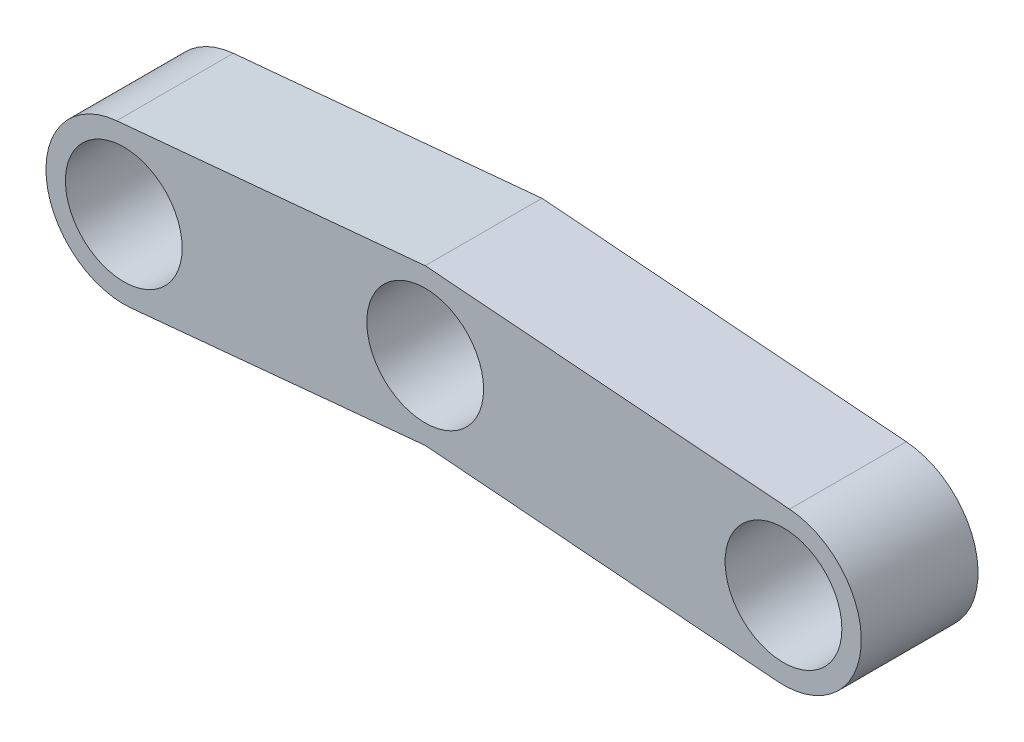
ISO-10303-21;
HEADER;
FILE_DESCRIPTION(('STEP AP214'),'2;1');
FILE_NAME('part.step','',(''),(''),'','','');
FILE_SCHEMA(('AUTOMOTIVE_DESIGN { 1 0 10303 214 1 1 1 1 }'));
ENDSEC;
DATA;
#1=APPLICATION_CONTEXT('core data for automotive mechanical design processes');
#2=APPLICATION_PROTOCOL_DEFINITION('international standard','automotive_design',2000,#1);
#3=PRODUCT_CONTEXT('',#1,'mechanical');
#4=PRODUCT('Part','Part','',(#3));
#5=PRODUCT_RELATED_PRODUCT_CATEGORY('part','',(#4));
#6=PRODUCT_DEFINITION_FORMATION('','',#4);
#7=PRODUCT_DEFINITION_CONTEXT('part definition',#1,'design');
#8=PRODUCT_DEFINITION('design','',#6,#7);
#9=PRODUCT_DEFINITION_SHAPE('','',#8);
#10=(LENGTH_UNIT() NAMED_UNIT(*) SI_UNIT(.MILLI.,.METRE.));
#11=(NAMED_UNIT(*) PLANE_ANGLE_UNIT() SI_UNIT($,.RADIAN.));
#12=(NAMED_UNIT(*) SI_UNIT($,.STERADIAN.) SOLID_ANGLE_UNIT());
#13=UNCERTAINTY_MEASURE_WITH_UNIT(LENGTH_MEASURE(1.E-05),#10,'distance_accuracy_value','');
#14=(GEOMETRIC_REPRESENTATION_CONTEXT(3) GLOBAL_UNCERTAINTY_ASSIGNED_CONTEXT((#13)) GLOBAL_UNIT_ASSIGNED_CONTEXT((#10,
#11,#12)) REPRESENTATION_CONTEXT('',''));
#15=CARTESIAN_POINT('',(0.,0.,0.));
#16=DIRECTION('',(0.,0.,1.));
#17=DIRECTION('',(1.,0.,0.));
#18=AXIS2_PLACEMENT_3D('',#15,#16,#17);
#19=CARTESIAN_POINT('',(0.,0.,30.));
#20=DIRECTION('',(0.,0.,1.));
#21=DIRECTION('',(1.,0.,0.));
#22=AXIS2_PLACEMENT_3D('',#19,#20,#21);
#23=PLANE('',#22);
#24=CARTESIAN_POINT('',(169.517775154557,0.,30.));
#25=DIRECTION('',(0.,0.,1.));
#26=DIRECTION('',(1.,0.,0.));
#27=AXIS2_PLACEMENT_3D('',#24,#25,#26);
#28=CIRCLE('',#27,15.);
#29=CARTESIAN_POINT('',(184.517775154557,0.,30.));
#30=VERTEX_POINT('',#29);
#31=EDGE_CURVE('E188',#30,#30,#28,.T.);
#32=ORIENTED_EDGE('',*,*,#31,.F.);
#33=EDGE_LOOP('',(#32));
#34=FACE_BOUND('',#33,.T.);
#35=CARTESIAN_POINT('',(0.,0.,30.));
#36=DIRECTION('',(0.,0.,1.));
#37=DIRECTION('',(1.,0.,0.));
#38=AXIS2_PLACEMENT_3D('',#35,#36,#37);
#39=CIRCLE('',#38,20.);
#40=CARTESIAN_POINT('',(-1.85478455042669,19.9138086329938,30.));
#41=VERTEX_POINT('',#40);
#42=CARTESIAN_POINT('',(1.90000011738152,-19.9095454381548,30.));
#43=VERTEX_POINT('',#42);
#44=EDGE_CURVE('E133',#41,#43,#39,.T.);
#45=ORIENTED_EDGE('',*,*,#44,.T.);
#46=DIRECTION('',(0.995477271907739,0.0950000058690759,0.));
#47=VECTOR('',#46,1.);
#48=CARTESIAN_POINT('',(1.90000011738152,-19.9095454381548,30.));
#49=LINE('',#48,#47);
#50=CARTESIAN_POINT('',(77.4467178129584,-12.7,30.));
#51=VERTEX_POINT('',#50);
#52=EDGE_CURVE('E91',#43,#51,#49,.T.);
#53=ORIENTED_EDGE('',*,*,#52,.T.);
#54=DIRECTION('',(0.996816843082874,-0.0797256630345115,0.));
#55=VECTOR('',#54,1.);
#56=CARTESIAN_POINT('',(77.4467178129584,-12.7,30.));
#57=LINE('',#56,#55);
#58=CARTESIAN_POINT('',(167.923261893867,-19.9363368616575,30.));
#59=VERTEX_POINT('',#58);
#60=EDGE_CURVE('E104',#51,#59,#57,.T.);
#61=ORIENTED_EDGE('',*,*,#60,.T.);
#62=CARTESIAN_POINT('',(169.517775154557,0.,30.));
#63=DIRECTION('',(0.,0.,1.));
#64=DIRECTION('',(-1.,0.,0.));
#65=AXIS2_PLACEMENT_3D('',#62,#63,#64);
#66=CIRCLE('',#65,20.);
#67=CARTESIAN_POINT('',(171.08526553398,19.9384797291673,30.));
#68=VERTEX_POINT('',#67);
#69=EDGE_CURVE('E98',#59,#68,#66,.T.);
#70=ORIENTED_EDGE('',*,*,#69,.T.);
#71=DIRECTION('',(-0.996923986458366,0.0783745189711544,0.));
#72=VECTOR('',#71,1.);
#73=CARTESIAN_POINT('',(77.4467178129584,27.3,30.));
#74=LINE('',#73,#72);
#75=CARTESIAN_POINT('',(77.4467178129584,27.3,30.));
#76=VERTEX_POINT('',#75);
#77=EDGE_CURVE('E102',#68,#76,#74,.T.);
#78=ORIENTED_EDGE('',*,*,#77,.T.);
#79=DIRECTION('',(-0.99569043164969,-0.0927392275213345,0.));
#80=VECTOR('',#79,1.);
#81=CARTESIAN_POINT('',(-1.85478455042669,19.9138086329938,30.));
#82=LINE('',#81,#80);
#83=EDGE_CURVE('E54',#76,#41,#82,.T.);
#84=ORIENTED_EDGE('',*,*,#83,.T.);
#85=EDGE_LOOP('',(#45,#53,#61,#70,#78,#84));
#86=FACE_BOUND('',#85,.T.);
#87=CARTESIAN_POINT('',(77.4467178129584,7.3,30.));
#88=DIRECTION('',(0.,0.,1.));
#89=DIRECTION('',(1.,0.,0.));
#90=AXIS2_PLACEMENT_3D('',#87,#88,#89);
#91=CIRCLE('',#90,15.);
#92=CARTESIAN_POINT('',(92.4467178129584,7.3,30.));
#93=VERTEX_POINT('',#92);
#94=EDGE_CURVE('E126',#93,#93,#91,.T.);
#95=ORIENTED_EDGE('',*,*,#94,.F.);
#96=EDGE_LOOP('',(#95));
#97=FACE_BOUND('',#96,.T.);
#98=CARTESIAN_POINT('',(0.,0.,30.));
#99=DIRECTION('',(0.,0.,1.));
#100=DIRECTION('',(1.,0.,0.));
#101=AXIS2_PLACEMENT_3D('',#98,#99,#100);
#102=CIRCLE('',#101,15.);
#103=CARTESIAN_POINT('',(15.,0.,30.));
#104=VERTEX_POINT('',#103);
#105=EDGE_CURVE('E179',#104,#104,#102,.T.);
#106=ORIENTED_EDGE('',*,*,#105,.F.);
#107=EDGE_LOOP('',(#106));
#108=FACE_BOUND('',#107,.T.);
#109=ADVANCED_FACE('F37',(#34,#86,#97,#108),#23,.T.);
#110=CARTESIAN_POINT('',(0.,0.,0.));
#111=DIRECTION('',(0.,0.,1.));
#112=DIRECTION('',(1.,0.,0.));
#113=AXIS2_PLACEMENT_3D('',#110,#111,#112);
#114=PLANE('',#113);
#115=CARTESIAN_POINT('',(0.,0.,0.));
#116=DIRECTION('',(0.,0.,1.));
#117=DIRECTION('',(1.,0.,0.));
#118=AXIS2_PLACEMENT_3D('',#115,#116,#117);
#119=CIRCLE('',#118,20.);
#120=CARTESIAN_POINT('',(-1.85478455042669,19.9138086329938,0.));
#121=VERTEX_POINT('',#120);
#122=CARTESIAN_POINT('',(1.90000011738152,-19.9095454381548,0.));
#123=VERTEX_POINT('',#122);
#124=EDGE_CURVE('E122',#121,#123,#119,.T.);
#125=ORIENTED_EDGE('',*,*,#124,.F.);
#126=DIRECTION('',(-0.99569043164969,-0.0927392275213345,0.));
#127=VECTOR('',#126,1.);
#128=CARTESIAN_POINT('',(-1.85478455042669,19.9138086329938,0.));
#129=LINE('',#128,#127);
#130=CARTESIAN_POINT('',(77.4467178129584,27.3,0.));
#131=VERTEX_POINT('',#130);
#132=EDGE_CURVE('E83',#131,#121,#129,.T.);
#133=ORIENTED_EDGE('',*,*,#132,.F.);
#134=DIRECTION('',(-0.996923986458366,0.0783745189711544,0.));
#135=VECTOR('',#134,1.);
#136=CARTESIAN_POINT('',(77.4467178129584,27.3,0.));
#137=LINE('',#136,#135);
#138=CARTESIAN_POINT('',(171.08526553398,19.9384797291673,0.));
#139=VERTEX_POINT('',#138);
#140=EDGE_CURVE('E77',#139,#131,#137,.T.);
#141=ORIENTED_EDGE('',*,*,#140,.F.);
#142=CARTESIAN_POINT('',(169.517775154557,0.,0.));
#143=DIRECTION('',(0.,0.,1.));
#144=DIRECTION('',(-1.,0.,0.));
#145=AXIS2_PLACEMENT_3D('',#142,#143,#144);
#146=CIRCLE('',#145,20.);
#147=CARTESIAN_POINT('',(167.923261893867,-19.9363368616575,0.));
#148=VERTEX_POINT('',#147);
#149=EDGE_CURVE('E112',#148,#139,#146,.T.);
#150=ORIENTED_EDGE('',*,*,#149,.F.);
#151=DIRECTION('',(0.996816843082874,-0.0797256630345115,0.));
#152=VECTOR('',#151,1.);
#153=CARTESIAN_POINT('',(77.4467178129584,-12.7,0.));
#154=LINE('',#153,#152);
#155=CARTESIAN_POINT('',(77.4467178129584,-12.7,0.));
#156=VERTEX_POINT('',#155);
#157=EDGE_CURVE('E128',#156,#148,#154,.T.);
#158=ORIENTED_EDGE('',*,*,#157,.F.);
#159=DIRECTION('',(0.995477271907739,0.0950000058690759,0.));
#160=VECTOR('',#159,1.);
#161=CARTESIAN_POINT('',(1.90000011738152,-19.9095454381548,0.));
#162=LINE('',#161,#160);
#163=EDGE_CURVE('E125',#123,#156,#162,.T.);
#164=ORIENTED_EDGE('',*,*,#163,.F.);
#165=EDGE_LOOP('',(#125,#133,#141,#150,#158,#164));
#166=FACE_BOUND('',#165,.T.);
#167=CARTESIAN_POINT('',(77.4467178129584,7.3,0.));
#168=DIRECTION('',(0.,0.,1.));
#169=DIRECTION('',(1.,0.,0.));
#170=AXIS2_PLACEMENT_3D('',#167,#168,#169);
#171=CIRCLE('',#170,15.);
#172=CARTESIAN_POINT('',(92.4467178129584,7.3,0.));
#173=VERTEX_POINT('',#172);
#174=EDGE_CURVE('E191',#173,#173,#171,.T.);
#175=ORIENTED_EDGE('',*,*,#174,.T.);
#176=EDGE_LOOP('',(#175));
#177=FACE_BOUND('',#176,.T.);
#178=CARTESIAN_POINT('',(169.517775154557,0.,0.));
#179=DIRECTION('',(0.,0.,1.));
#180=DIRECTION('',(1.,0.,0.));
#181=AXIS2_PLACEMENT_3D('',#178,#179,#180);
#182=CIRCLE('',#181,15.);
#183=CARTESIAN_POINT('',(184.517775154557,0.,0.));
#184=VERTEX_POINT('',#183);
#185=EDGE_CURVE('E185',#184,#184,#182,.T.);
#186=ORIENTED_EDGE('',*,*,#185,.T.);
#187=EDGE_LOOP('',(#186));
#188=FACE_BOUND('',#187,.T.);
#189=CARTESIAN_POINT('',(0.,0.,0.));
#190=DIRECTION('',(0.,0.,1.));
#191=DIRECTION('',(1.,0.,0.));
#192=AXIS2_PLACEMENT_3D('',#189,#190,#191);
#193=CIRCLE('',#192,15.);
#194=CARTESIAN_POINT('',(15.,0.,0.));
#195=VERTEX_POINT('',#194);
#196=EDGE_CURVE('E182',#195,#195,#193,.T.);
#197=ORIENTED_EDGE('',*,*,#196,.T.);
#198=EDGE_LOOP('',(#197));
#199=FACE_BOUND('',#198,.T.);
#200=ADVANCED_FACE('F142',(#166,#177,#188,#199),#114,.F.);
#201=CARTESIAN_POINT('',(0.,0.,30.));
#202=DIRECTION('',(0.,0.,-1.));
#203=DIRECTION('',(-1.,0.,0.));
#204=AXIS2_PLACEMENT_3D('',#201,#202,#203);
#205=CYLINDRICAL_SURFACE('',#204,20.);
#206=ORIENTED_EDGE('',*,*,#124,.T.);
#207=DIRECTION('',(0.,0.,-1.));
#208=VECTOR('',#207,1.);
#209=CARTESIAN_POINT('',(1.90000011738152,-19.9095454381548,30.));
#210=LINE('',#209,#208);
#211=EDGE_CURVE('E11',#43,#123,#210,.T.);
#212=ORIENTED_EDGE('',*,*,#211,.F.);
#213=ORIENTED_EDGE('',*,*,#44,.F.);
#214=DIRECTION('',(0.,0.,-1.));
#215=VECTOR('',#214,1.);
#216=CARTESIAN_POINT('',(-1.85478455042669,19.9138086329938,30.));
#217=LINE('',#216,#215);
#218=EDGE_CURVE('E118',#41,#121,#217,.T.);
#219=ORIENTED_EDGE('',*,*,#218,.T.);
#220=EDGE_LOOP('',(#206,#212,#213,#219));
#221=FACE_BOUND('',#220,.T.);
#222=ADVANCED_FACE('F39',(#221),#205,.T.);
#223=CARTESIAN_POINT('',(1.90000011738152,-19.9095454381548,30.));
#224=DIRECTION('',(-0.0950000058690759,0.995477271907739,0.));
#225=DIRECTION('',(-0.995477271907739,-0.0950000058690759,0.));
#226=AXIS2_PLACEMENT_3D('',#223,#224,#225);
#227=PLANE('',#226);
#228=ORIENTED_EDGE('',*,*,#163,.T.);
#229=DIRECTION('',(0.,0.,-1.));
#230=VECTOR('',#229,1.);
#231=CARTESIAN_POINT('',(77.4467178129584,-12.7,30.));
#232=LINE('',#231,#230);
#233=EDGE_CURVE('E46',#51,#156,#232,.T.);
#234=ORIENTED_EDGE('',*,*,#233,.F.);
#235=ORIENTED_EDGE('',*,*,#52,.F.);
#236=ORIENTED_EDGE('',*,*,#211,.T.);
#237=EDGE_LOOP('',(#228,#234,#235,#236));
#238=FACE_BOUND('',#237,.T.);
#239=ADVANCED_FACE('F245',(#238),#227,.F.);
#240=CARTESIAN_POINT('',(77.4467178129584,-12.7,30.));
#241=DIRECTION('',(0.0797256630345115,0.996816843082874,0.));
#242=DIRECTION('',(-0.996816843082874,0.0797256630345115,0.));
#243=AXIS2_PLACEMENT_3D('',#240,#241,#242);
#244=PLANE('',#243);
#245=ORIENTED_EDGE('',*,*,#157,.T.);
#246=DIRECTION('',(0.,0.,-1.));
#247=VECTOR('',#246,1.);
#248=CARTESIAN_POINT('',(167.923261893867,-19.9363368616575,30.));
#249=LINE('',#248,#247);
#250=EDGE_CURVE('E113',#59,#148,#249,.T.);
#251=ORIENTED_EDGE('',*,*,#250,.F.);
#252=ORIENTED_EDGE('',*,*,#60,.F.);
#253=ORIENTED_EDGE('',*,*,#233,.T.);
#254=EDGE_LOOP('',(#245,#251,#252,#253));
#255=FACE_BOUND('',#254,.T.);
#256=ADVANCED_FACE('F139',(#255),#244,.F.);
#257=CARTESIAN_POINT('',(169.517775154557,0.,30.));
#258=DIRECTION('',(0.,0.,-1.));
#259=DIRECTION('',(-1.,0.,0.));
#260=AXIS2_PLACEMENT_3D('',#257,#258,#259);
#261=CYLINDRICAL_SURFACE('',#260,20.);
#262=ORIENTED_EDGE('',*,*,#149,.T.);
#263=DIRECTION('',(0.,0.,-1.));
#264=VECTOR('',#263,1.);
#265=CARTESIAN_POINT('',(171.08526553398,19.9384797291673,30.));
#266=LINE('',#265,#264);
#267=EDGE_CURVE('E109',#68,#139,#266,.T.);
#268=ORIENTED_EDGE('',*,*,#267,.F.);
#269=ORIENTED_EDGE('',*,*,#69,.F.);
#270=ORIENTED_EDGE('',*,*,#250,.T.);
#271=EDGE_LOOP('',(#262,#268,#269,#270));
#272=FACE_BOUND('',#271,.T.);
#273=ADVANCED_FACE('F110',(#272),#261,.T.);
#274=CARTESIAN_POINT('',(77.4467178129584,27.3,30.));
#275=DIRECTION('',(-0.0783745189711544,-0.996923986458366,0.));
#276=DIRECTION('',(0.996923986458366,-0.0783745189711544,0.));
#277=AXIS2_PLACEMENT_3D('',#274,#275,#276);
#278=PLANE('',#277);
#279=ORIENTED_EDGE('',*,*,#140,.T.);
#280=DIRECTION('',(0.,0.,-1.));
#281=VECTOR('',#280,1.);
#282=CARTESIAN_POINT('',(77.4467178129584,27.3,30.));
#283=LINE('',#282,#281);
#284=EDGE_CURVE('E114',#76,#131,#283,.T.);
#285=ORIENTED_EDGE('',*,*,#284,.F.);
#286=ORIENTED_EDGE('',*,*,#77,.F.);
#287=ORIENTED_EDGE('',*,*,#267,.T.);
#288=EDGE_LOOP('',(#279,#285,#286,#287));
#289=FACE_BOUND('',#288,.T.);
#290=ADVANCED_FACE('F116',(#289),#278,.F.);
#291=CARTESIAN_POINT('',(-1.85478455042669,19.9138086329938,30.));
#292=DIRECTION('',(0.0927392275213345,-0.99569043164969,0.));
#293=DIRECTION('',(0.99569043164969,0.0927392275213345,0.));
#294=AXIS2_PLACEMENT_3D('',#291,#292,#293);
#295=PLANE('',#294);
#296=ORIENTED_EDGE('',*,*,#132,.T.);
#297=ORIENTED_EDGE('',*,*,#218,.F.);
#298=ORIENTED_EDGE('',*,*,#83,.F.);
#299=ORIENTED_EDGE('',*,*,#284,.T.);
#300=EDGE_LOOP('',(#296,#297,#298,#299));
#301=FACE_BOUND('',#300,.T.);
#302=ADVANCED_FACE('F147',(#301),#295,.F.);
#303=CARTESIAN_POINT('',(77.4467178129584,7.3,30.));
#304=DIRECTION('',(0.,0.,-1.));
#305=DIRECTION('',(-1.,0.,0.));
#306=AXIS2_PLACEMENT_3D('',#303,#304,#305);
#307=CYLINDRICAL_SURFACE('',#306,15.);
#308=ORIENTED_EDGE('',*,*,#94,.T.);
#309=EDGE_LOOP('',(#308));
#310=FACE_BOUND('',#309,.T.);
#311=ORIENTED_EDGE('',*,*,#174,.F.);
#312=EDGE_LOOP('',(#311));
#313=FACE_BOUND('',#312,.T.);
#314=ADVANCED_FACE('F149',(#310,#313),#307,.F.);
#315=CARTESIAN_POINT('',(169.517775154557,0.,30.));
#316=DIRECTION('',(0.,0.,-1.));
#317=DIRECTION('',(-1.,0.,0.));
#318=AXIS2_PLACEMENT_3D('',#315,#316,#317);
#319=CYLINDRICAL_SURFACE('',#318,15.);
#320=ORIENTED_EDGE('',*,*,#31,.T.);
#321=EDGE_LOOP('',(#320));
#322=FACE_BOUND('',#321,.T.);
#323=ORIENTED_EDGE('',*,*,#185,.F.);
#324=EDGE_LOOP('',(#323));
#325=FACE_BOUND('',#324,.T.);
#326=ADVANCED_FACE('F155',(#322,#325),#319,.F.);
#327=CARTESIAN_POINT('',(0.,0.,30.));
#328=DIRECTION('',(0.,0.,-1.));
#329=DIRECTION('',(-1.,0.,0.));
#330=AXIS2_PLACEMENT_3D('',#327,#328,#329);
#331=CYLINDRICAL_SURFACE('',#330,15.);
#332=ORIENTED_EDGE('',*,*,#105,.T.);
#333=EDGE_LOOP('',(#332));
#334=FACE_BOUND('',#333,.T.);
#335=ORIENTED_EDGE('',*,*,#196,.F.);
#336=EDGE_LOOP('',(#335));
#337=FACE_BOUND('',#336,.T.);
#338=ADVANCED_FACE('F170',(#334,#337),#331,.F.);
#339=CLOSED_SHELL('',(#109,#200,#222,#239,#256,#273,#290,#302,#314,#326,#338));
#340=MANIFOLD_SOLID_BREP('B2',#339);
#341=ADVANCED_BREP_SHAPE_REPRESENTATION('',(#18,#340),#14);
#342=SHAPE_DEFINITION_REPRESENTATION(#9,#341);
ENDSEC;
END-ISO-10303-21;
